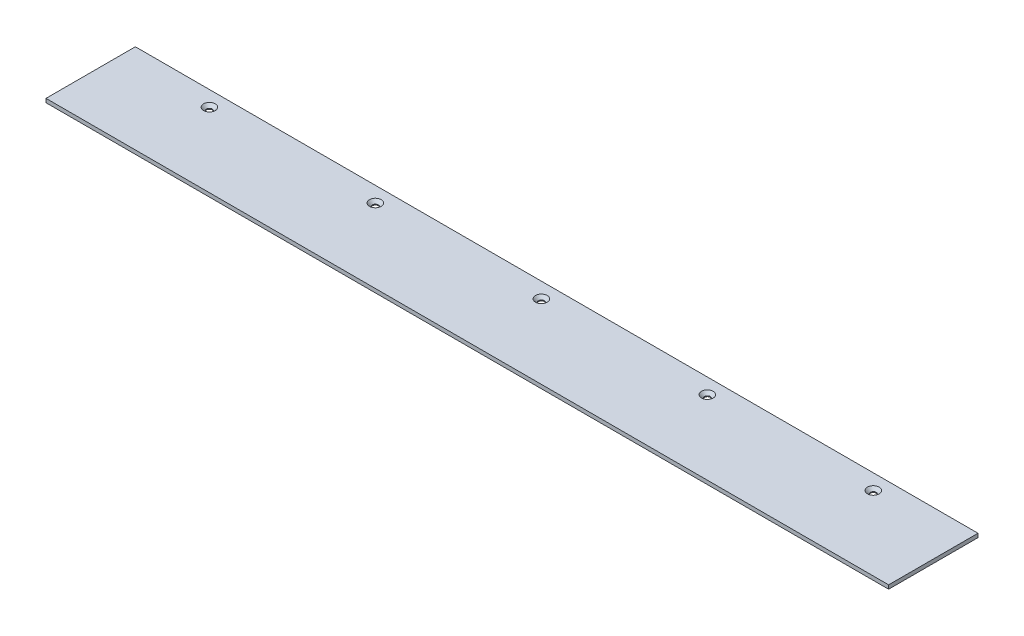
ISO-10303-21;
HEADER;
FILE_DESCRIPTION(('STEP AP214'),'2;1');
FILE_NAME('part.step','',(''),(''),'','','');
FILE_SCHEMA(('AUTOMOTIVE_DESIGN { 1 0 10303 214 1 1 1 1 }'));
ENDSEC;
DATA;
#1=APPLICATION_CONTEXT('core data for automotive mechanical design processes');
#2=APPLICATION_PROTOCOL_DEFINITION('international standard','automotive_design',2000,#1);
#3=PRODUCT_CONTEXT('',#1,'mechanical');
#4=PRODUCT('Part','Part','',(#3));
#5=PRODUCT_RELATED_PRODUCT_CATEGORY('part','',(#4));
#6=PRODUCT_DEFINITION_FORMATION('','',#4);
#7=PRODUCT_DEFINITION_CONTEXT('part definition',#1,'design');
#8=PRODUCT_DEFINITION('design','',#6,#7);
#9=PRODUCT_DEFINITION_SHAPE('','',#8);
#10=(LENGTH_UNIT() NAMED_UNIT(*) SI_UNIT(.MILLI.,.METRE.));
#11=(NAMED_UNIT(*) PLANE_ANGLE_UNIT() SI_UNIT($,.RADIAN.));
#12=(NAMED_UNIT(*) SI_UNIT($,.STERADIAN.) SOLID_ANGLE_UNIT());
#13=UNCERTAINTY_MEASURE_WITH_UNIT(LENGTH_MEASURE(1.E-05),#10,'distance_accuracy_value','');
#14=(GEOMETRIC_REPRESENTATION_CONTEXT(3) GLOBAL_UNCERTAINTY_ASSIGNED_CONTEXT((#13)) GLOBAL_UNIT_ASSIGNED_CONTEXT((#10,
#11,#12)) REPRESENTATION_CONTEXT('',''));
#15=CARTESIAN_POINT('',(0.,0.,0.));
#16=DIRECTION('',(0.,0.,1.));
#17=DIRECTION('',(1.,0.,0.));
#18=AXIS2_PLACEMENT_3D('',#15,#16,#17);
#19=CARTESIAN_POINT('',(-330.,3.,-35.));
#20=DIRECTION('',(1.,0.,0.));
#21=DIRECTION('',(0.,0.,-1.));
#22=AXIS2_PLACEMENT_3D('',#19,#20,#21);
#23=PLANE('',#22);
#24=DIRECTION('',(0.,0.,1.));
#25=VECTOR('',#24,1.);
#26=CARTESIAN_POINT('',(-330.,0.,-35.));
#27=LINE('',#26,#25);
#28=CARTESIAN_POINT('',(-330.,0.,-35.));
#29=VERTEX_POINT('',#28);
#30=CARTESIAN_POINT('',(-330.,0.,35.));
#31=VERTEX_POINT('',#30);
#32=EDGE_CURVE('E103',#29,#31,#27,.T.);
#33=ORIENTED_EDGE('',*,*,#32,.T.);
#34=DIRECTION('',(0.,-1.,0.));
#35=VECTOR('',#34,1.);
#36=CARTESIAN_POINT('',(-330.,3.,35.));
#37=LINE('',#36,#35);
#38=CARTESIAN_POINT('',(-330.,3.,35.));
#39=VERTEX_POINT('',#38);
#40=EDGE_CURVE('E94',#39,#31,#37,.T.);
#41=ORIENTED_EDGE('',*,*,#40,.F.);
#42=DIRECTION('',(0.,0.,1.));
#43=VECTOR('',#42,1.);
#44=CARTESIAN_POINT('',(-330.,3.,-35.));
#45=LINE('',#44,#43);
#46=CARTESIAN_POINT('',(-330.,3.,-35.));
#47=VERTEX_POINT('',#46);
#48=EDGE_CURVE('E88',#47,#39,#45,.T.);
#49=ORIENTED_EDGE('',*,*,#48,.F.);
#50=DIRECTION('',(0.,-1.,0.));
#51=VECTOR('',#50,1.);
#52=CARTESIAN_POINT('',(-330.,3.,-35.));
#53=LINE('',#52,#51);
#54=EDGE_CURVE('E99',#47,#29,#53,.T.);
#55=ORIENTED_EDGE('',*,*,#54,.T.);
#56=EDGE_LOOP('',(#33,#41,#49,#55));
#57=FACE_BOUND('',#56,.T.);
#58=ADVANCED_FACE('F34',(#57),#23,.F.);
#59=CARTESIAN_POINT('',(-330.,3.,35.));
#60=DIRECTION('',(0.,0.,-1.));
#61=DIRECTION('',(-1.,0.,0.));
#62=AXIS2_PLACEMENT_3D('',#59,#60,#61);
#63=PLANE('',#62);
#64=DIRECTION('',(1.,0.,0.));
#65=VECTOR('',#64,1.);
#66=CARTESIAN_POINT('',(-330.,0.,35.));
#67=LINE('',#66,#65);
#68=CARTESIAN_POINT('',(330.,0.,35.));
#69=VERTEX_POINT('',#68);
#70=EDGE_CURVE('E93',#31,#69,#67,.T.);
#71=ORIENTED_EDGE('',*,*,#70,.T.);
#72=DIRECTION('',(0.,-1.,0.));
#73=VECTOR('',#72,1.);
#74=CARTESIAN_POINT('',(330.,3.,35.));
#75=LINE('',#74,#73);
#76=CARTESIAN_POINT('',(330.,3.,35.));
#77=VERTEX_POINT('',#76);
#78=EDGE_CURVE('E91',#77,#69,#75,.T.);
#79=ORIENTED_EDGE('',*,*,#78,.F.);
#80=DIRECTION('',(1.,0.,0.));
#81=VECTOR('',#80,1.);
#82=CARTESIAN_POINT('',(-330.,3.,35.));
#83=LINE('',#82,#81);
#84=EDGE_CURVE('E82',#39,#77,#83,.T.);
#85=ORIENTED_EDGE('',*,*,#84,.F.);
#86=ORIENTED_EDGE('',*,*,#40,.T.);
#87=EDGE_LOOP('',(#71,#79,#85,#86));
#88=FACE_BOUND('',#87,.T.);
#89=ADVANCED_FACE('F92',(#88),#63,.F.);
#90=CARTESIAN_POINT('',(330.,3.,-35.));
#91=DIRECTION('',(-1.,0.,0.));
#92=DIRECTION('',(0.,0.,1.));
#93=AXIS2_PLACEMENT_3D('',#90,#91,#92);
#94=PLANE('',#93);
#95=DIRECTION('',(0.,0.,-1.));
#96=VECTOR('',#95,1.);
#97=CARTESIAN_POINT('',(330.,0.,-35.));
#98=LINE('',#97,#96);
#99=CARTESIAN_POINT('',(330.,0.,-35.));
#100=VERTEX_POINT('',#99);
#101=EDGE_CURVE('E68',#69,#100,#98,.T.);
#102=ORIENTED_EDGE('',*,*,#101,.T.);
#103=DIRECTION('',(0.,-1.,0.));
#104=VECTOR('',#103,1.);
#105=CARTESIAN_POINT('',(330.,3.,-35.));
#106=LINE('',#105,#104);
#107=CARTESIAN_POINT('',(330.,3.,-35.));
#108=VERTEX_POINT('',#107);
#109=EDGE_CURVE('E95',#108,#100,#106,.T.);
#110=ORIENTED_EDGE('',*,*,#109,.F.);
#111=DIRECTION('',(0.,0.,-1.));
#112=VECTOR('',#111,1.);
#113=CARTESIAN_POINT('',(330.,3.,-35.));
#114=LINE('',#113,#112);
#115=EDGE_CURVE('E86',#77,#108,#114,.T.);
#116=ORIENTED_EDGE('',*,*,#115,.F.);
#117=ORIENTED_EDGE('',*,*,#78,.T.);
#118=EDGE_LOOP('',(#102,#110,#116,#117));
#119=FACE_BOUND('',#118,.T.);
#120=ADVANCED_FACE('F97',(#119),#94,.F.);
#121=CARTESIAN_POINT('',(-330.,3.,-35.));
#122=DIRECTION('',(0.,0.,1.));
#123=DIRECTION('',(1.,0.,0.));
#124=AXIS2_PLACEMENT_3D('',#121,#122,#123);
#125=PLANE('',#124);
#126=DIRECTION('',(-1.,0.,0.));
#127=VECTOR('',#126,1.);
#128=CARTESIAN_POINT('',(-330.,0.,-35.));
#129=LINE('',#128,#127);
#130=EDGE_CURVE('E74',#100,#29,#129,.T.);
#131=ORIENTED_EDGE('',*,*,#130,.T.);
#132=ORIENTED_EDGE('',*,*,#54,.F.);
#133=DIRECTION('',(-1.,0.,0.));
#134=VECTOR('',#133,1.);
#135=CARTESIAN_POINT('',(-330.,3.,-35.));
#136=LINE('',#135,#134);
#137=EDGE_CURVE('E51',#108,#47,#136,.T.);
#138=ORIENTED_EDGE('',*,*,#137,.F.);
#139=ORIENTED_EDGE('',*,*,#109,.T.);
#140=EDGE_LOOP('',(#131,#132,#138,#139));
#141=FACE_BOUND('',#140,.T.);
#142=ADVANCED_FACE('F149',(#141),#125,.F.);
#143=CARTESIAN_POINT('',(0.,3.,0.));
#144=DIRECTION('',(0.,1.,0.));
#145=DIRECTION('',(0.,0.,1.));
#146=AXIS2_PLACEMENT_3D('',#143,#144,#145);
#147=PLANE('',#146);
#148=CARTESIAN_POINT('',(-130.,3.,-23.));
#149=DIRECTION('',(0.,1.,0.));
#150=DIRECTION('',(0.,0.,1.));
#151=AXIS2_PLACEMENT_3D('',#148,#149,#150);
#152=CIRCLE('',#151,4.58999999999998);
#153=CARTESIAN_POINT('',(-130.,3.,-18.41));
#154=VERTEX_POINT('',#153);
#155=EDGE_CURVE('E316',#154,#154,#152,.T.);
#156=ORIENTED_EDGE('',*,*,#155,.F.);
#157=EDGE_LOOP('',(#156));
#158=FACE_BOUND('',#157,.T.);
#159=CARTESIAN_POINT('',(-260.,3.,-23.));
#160=DIRECTION('',(0.,1.,0.));
#161=DIRECTION('',(0.,0.,1.));
#162=AXIS2_PLACEMENT_3D('',#159,#160,#161);
#163=CIRCLE('',#162,4.58999999999998);
#164=CARTESIAN_POINT('',(-260.,3.,-18.41));
#165=VERTEX_POINT('',#164);
#166=EDGE_CURVE('E304',#165,#165,#163,.T.);
#167=ORIENTED_EDGE('',*,*,#166,.F.);
#168=EDGE_LOOP('',(#167));
#169=FACE_BOUND('',#168,.T.);
#170=ORIENTED_EDGE('',*,*,#48,.T.);
#171=ORIENTED_EDGE('',*,*,#84,.T.);
#172=ORIENTED_EDGE('',*,*,#115,.T.);
#173=ORIENTED_EDGE('',*,*,#137,.T.);
#174=EDGE_LOOP('',(#170,#171,#172,#173));
#175=FACE_BOUND('',#174,.T.);
#176=CARTESIAN_POINT('',(0.,3.,-23.));
#177=DIRECTION('',(0.,1.,0.));
#178=DIRECTION('',(0.,0.,1.));
#179=AXIS2_PLACEMENT_3D('',#176,#177,#178);
#180=CIRCLE('',#179,4.58999999999998);
#181=CARTESIAN_POINT('',(0.,3.,-18.41));
#182=VERTEX_POINT('',#181);
#183=EDGE_CURVE('E113',#182,#182,#180,.T.);
#184=ORIENTED_EDGE('',*,*,#183,.F.);
#185=EDGE_LOOP('',(#184));
#186=FACE_BOUND('',#185,.T.);
#187=CARTESIAN_POINT('',(130.,3.,-23.));
#188=DIRECTION('',(0.,1.,0.));
#189=DIRECTION('',(0.,0.,1.));
#190=AXIS2_PLACEMENT_3D('',#187,#188,#189);
#191=CIRCLE('',#190,4.58999999999998);
#192=CARTESIAN_POINT('',(130.,3.,-18.41));
#193=VERTEX_POINT('',#192);
#194=EDGE_CURVE('E122',#193,#193,#191,.T.);
#195=ORIENTED_EDGE('',*,*,#194,.F.);
#196=EDGE_LOOP('',(#195));
#197=FACE_BOUND('',#196,.T.);
#198=CARTESIAN_POINT('',(260.,3.,-23.));
#199=DIRECTION('',(0.,1.,0.));
#200=DIRECTION('',(0.,0.,1.));
#201=AXIS2_PLACEMENT_3D('',#198,#199,#200);
#202=CIRCLE('',#201,4.58999999999998);
#203=CARTESIAN_POINT('',(260.,3.,-18.41));
#204=VERTEX_POINT('',#203);
#205=EDGE_CURVE('E131',#204,#204,#202,.T.);
#206=ORIENTED_EDGE('',*,*,#205,.F.);
#207=EDGE_LOOP('',(#206));
#208=FACE_BOUND('',#207,.T.);
#209=ADVANCED_FACE('F83',(#158,#169,#175,#186,#197,#208),#147,.T.);
#210=CARTESIAN_POINT('',(0.,0.,0.));
#211=DIRECTION('',(0.,1.,0.));
#212=DIRECTION('',(0.,0.,1.));
#213=AXIS2_PLACEMENT_3D('',#210,#211,#212);
#214=PLANE('',#213);
#215=CARTESIAN_POINT('',(-130.,0.,-23.));
#216=DIRECTION('',(0.,1.,0.));
#217=DIRECTION('',(0.,0.,1.));
#218=AXIS2_PLACEMENT_3D('',#215,#216,#217);
#219=CIRCLE('',#218,2.24999999999997);
#220=CARTESIAN_POINT('',(-130.,0.,-20.75));
#221=VERTEX_POINT('',#220);
#222=EDGE_CURVE('E313',#221,#221,#219,.T.);
#223=ORIENTED_EDGE('',*,*,#222,.T.);
#224=EDGE_LOOP('',(#223));
#225=FACE_BOUND('',#224,.T.);
#226=CARTESIAN_POINT('',(-260.,0.,-23.));
#227=DIRECTION('',(0.,1.,0.));
#228=DIRECTION('',(0.,0.,1.));
#229=AXIS2_PLACEMENT_3D('',#226,#227,#228);
#230=CIRCLE('',#229,2.24999999999997);
#231=CARTESIAN_POINT('',(-260.,0.,-20.75));
#232=VERTEX_POINT('',#231);
#233=EDGE_CURVE('E106',#232,#232,#230,.T.);
#234=ORIENTED_EDGE('',*,*,#233,.T.);
#235=EDGE_LOOP('',(#234));
#236=FACE_BOUND('',#235,.T.);
#237=ORIENTED_EDGE('',*,*,#32,.F.);
#238=ORIENTED_EDGE('',*,*,#130,.F.);
#239=ORIENTED_EDGE('',*,*,#101,.F.);
#240=ORIENTED_EDGE('',*,*,#70,.F.);
#241=EDGE_LOOP('',(#237,#238,#239,#240));
#242=FACE_BOUND('',#241,.T.);
#243=CARTESIAN_POINT('',(0.,0.,-23.));
#244=DIRECTION('',(0.,1.,0.));
#245=DIRECTION('',(0.,0.,1.));
#246=AXIS2_PLACEMENT_3D('',#243,#244,#245);
#247=CIRCLE('',#246,2.24999999999997);
#248=CARTESIAN_POINT('',(0.,0.,-20.75));
#249=VERTEX_POINT('',#248);
#250=EDGE_CURVE('E116',#249,#249,#247,.T.);
#251=ORIENTED_EDGE('',*,*,#250,.T.);
#252=EDGE_LOOP('',(#251));
#253=FACE_BOUND('',#252,.T.);
#254=CARTESIAN_POINT('',(130.,0.,-23.));
#255=DIRECTION('',(0.,1.,0.));
#256=DIRECTION('',(0.,0.,1.));
#257=AXIS2_PLACEMENT_3D('',#254,#255,#256);
#258=CIRCLE('',#257,2.24999999999997);
#259=CARTESIAN_POINT('',(130.,0.,-20.75));
#260=VERTEX_POINT('',#259);
#261=EDGE_CURVE('E125',#260,#260,#258,.T.);
#262=ORIENTED_EDGE('',*,*,#261,.T.);
#263=EDGE_LOOP('',(#262));
#264=FACE_BOUND('',#263,.T.);
#265=CARTESIAN_POINT('',(260.,0.,-23.));
#266=DIRECTION('',(0.,1.,0.));
#267=DIRECTION('',(0.,0.,1.));
#268=AXIS2_PLACEMENT_3D('',#265,#266,#267);
#269=CIRCLE('',#268,2.24999999999997);
#270=CARTESIAN_POINT('',(260.,0.,-20.75));
#271=VERTEX_POINT('',#270);
#272=EDGE_CURVE('E43',#271,#271,#269,.T.);
#273=ORIENTED_EDGE('',*,*,#272,.T.);
#274=EDGE_LOOP('',(#273));
#275=FACE_BOUND('',#274,.T.);
#276=ADVANCED_FACE('F136',(#225,#236,#242,#253,#264,#275),#214,.F.);
#277=CARTESIAN_POINT('',(-260.,3.,-23.));
#278=DIRECTION('',(0.,1.,0.));
#279=DIRECTION('',(0.,0.,1.));
#280=AXIS2_PLACEMENT_3D('',#277,#278,#279);
#281=CYLINDRICAL_SURFACE('',#280,2.24999999999997);
#282=ORIENTED_EDGE('',*,*,#233,.F.);
#283=EDGE_LOOP('',(#282));
#284=FACE_BOUND('',#283,.T.);
#285=CARTESIAN_POINT('',(-260.,0.660000000000001,-23.));
#286=DIRECTION('',(0.,1.,0.));
#287=DIRECTION('',(0.,0.,1.));
#288=AXIS2_PLACEMENT_3D('',#285,#286,#287);
#289=CIRCLE('',#288,2.24999999999997);
#290=CARTESIAN_POINT('',(-260.,0.660000000000001,-20.75));
#291=VERTEX_POINT('',#290);
#292=EDGE_CURVE('E303',#291,#291,#289,.T.);
#293=ORIENTED_EDGE('',*,*,#292,.T.);
#294=EDGE_LOOP('',(#293));
#295=FACE_BOUND('',#294,.T.);
#296=ADVANCED_FACE('F156',(#284,#295),#281,.F.);
#297=CARTESIAN_POINT('',(-260.,3.,-23.));
#298=DIRECTION('',(0.,1.,0.));
#299=DIRECTION('',(0.,0.,1.));
#300=AXIS2_PLACEMENT_3D('',#297,#298,#299);
#301=CONICAL_SURFACE('',#300,4.58999999999998,0.78539816339745);
#302=ORIENTED_EDGE('',*,*,#292,.F.);
#303=EDGE_LOOP('',(#302));
#304=FACE_BOUND('',#303,.T.);
#305=ORIENTED_EDGE('',*,*,#166,.T.);
#306=EDGE_LOOP('',(#305));
#307=FACE_BOUND('',#306,.T.);
#308=ADVANCED_FACE('F242',(#304,#307),#301,.F.);
#309=CARTESIAN_POINT('',(-130.,3.,-23.));
#310=DIRECTION('',(0.,1.,0.));
#311=DIRECTION('',(0.,0.,1.));
#312=AXIS2_PLACEMENT_3D('',#309,#310,#311);
#313=CYLINDRICAL_SURFACE('',#312,2.24999999999997);
#314=ORIENTED_EDGE('',*,*,#222,.F.);
#315=EDGE_LOOP('',(#314));
#316=FACE_BOUND('',#315,.T.);
#317=CARTESIAN_POINT('',(-130.,0.660000000000001,-23.));
#318=DIRECTION('',(0.,1.,0.));
#319=DIRECTION('',(0.,0.,1.));
#320=AXIS2_PLACEMENT_3D('',#317,#318,#319);
#321=CIRCLE('',#320,2.24999999999997);
#322=CARTESIAN_POINT('',(-130.,0.660000000000001,-20.75));
#323=VERTEX_POINT('',#322);
#324=EDGE_CURVE('E308',#323,#323,#321,.T.);
#325=ORIENTED_EDGE('',*,*,#324,.T.);
#326=EDGE_LOOP('',(#325));
#327=FACE_BOUND('',#326,.T.);
#328=ADVANCED_FACE('F233',(#316,#327),#313,.F.);
#329=CARTESIAN_POINT('',(-130.,3.,-23.));
#330=DIRECTION('',(0.,1.,0.));
#331=DIRECTION('',(0.,0.,1.));
#332=AXIS2_PLACEMENT_3D('',#329,#330,#331);
#333=CONICAL_SURFACE('',#332,4.58999999999998,0.78539816339745);
#334=ORIENTED_EDGE('',*,*,#324,.F.);
#335=EDGE_LOOP('',(#334));
#336=FACE_BOUND('',#335,.T.);
#337=ORIENTED_EDGE('',*,*,#155,.T.);
#338=EDGE_LOOP('',(#337));
#339=FACE_BOUND('',#338,.T.);
#340=ADVANCED_FACE('F180',(#336,#339),#333,.F.);
#341=CARTESIAN_POINT('',(0.,3.,-23.));
#342=DIRECTION('',(0.,1.,0.));
#343=DIRECTION('',(0.,0.,1.));
#344=AXIS2_PLACEMENT_3D('',#341,#342,#343);
#345=CONICAL_SURFACE('',#344,4.58999999999998,0.78539816339745);
#346=CARTESIAN_POINT('',(0.,0.660000000000001,-23.));
#347=DIRECTION('',(0.,1.,0.));
#348=DIRECTION('',(0.,0.,1.));
#349=AXIS2_PLACEMENT_3D('',#346,#347,#348);
#350=CIRCLE('',#349,2.24999999999997);
#351=CARTESIAN_POINT('',(0.,0.660000000000001,-20.75));
#352=VERTEX_POINT('',#351);
#353=EDGE_CURVE('E119',#352,#352,#350,.T.);
#354=ORIENTED_EDGE('',*,*,#353,.F.);
#355=EDGE_LOOP('',(#354));
#356=FACE_BOUND('',#355,.T.);
#357=ORIENTED_EDGE('',*,*,#183,.T.);
#358=EDGE_LOOP('',(#357));
#359=FACE_BOUND('',#358,.T.);
#360=ADVANCED_FACE('F176',(#356,#359),#345,.F.);
#361=CARTESIAN_POINT('',(0.,3.,-23.));
#362=DIRECTION('',(0.,1.,0.));
#363=DIRECTION('',(0.,0.,1.));
#364=AXIS2_PLACEMENT_3D('',#361,#362,#363);
#365=CYLINDRICAL_SURFACE('',#364,2.24999999999997);
#366=ORIENTED_EDGE('',*,*,#250,.F.);
#367=EDGE_LOOP('',(#366));
#368=FACE_BOUND('',#367,.T.);
#369=ORIENTED_EDGE('',*,*,#353,.T.);
#370=EDGE_LOOP('',(#369));
#371=FACE_BOUND('',#370,.T.);
#372=ADVANCED_FACE('F172',(#368,#371),#365,.F.);
#373=CARTESIAN_POINT('',(130.,3.,-23.));
#374=DIRECTION('',(0.,1.,0.));
#375=DIRECTION('',(0.,0.,1.));
#376=AXIS2_PLACEMENT_3D('',#373,#374,#375);
#377=CONICAL_SURFACE('',#376,4.58999999999998,0.78539816339745);
#378=CARTESIAN_POINT('',(130.,0.660000000000001,-23.));
#379=DIRECTION('',(0.,1.,0.));
#380=DIRECTION('',(0.,0.,1.));
#381=AXIS2_PLACEMENT_3D('',#378,#379,#380);
#382=CIRCLE('',#381,2.24999999999997);
#383=CARTESIAN_POINT('',(130.,0.660000000000001,-20.75));
#384=VERTEX_POINT('',#383);
#385=EDGE_CURVE('E128',#384,#384,#382,.T.);
#386=ORIENTED_EDGE('',*,*,#385,.F.);
#387=EDGE_LOOP('',(#386));
#388=FACE_BOUND('',#387,.T.);
#389=ORIENTED_EDGE('',*,*,#194,.T.);
#390=EDGE_LOOP('',(#389));
#391=FACE_BOUND('',#390,.T.);
#392=ADVANCED_FACE('F175',(#388,#391),#377,.F.);
#393=CARTESIAN_POINT('',(130.,3.,-23.));
#394=DIRECTION('',(0.,1.,0.));
#395=DIRECTION('',(0.,0.,1.));
#396=AXIS2_PLACEMENT_3D('',#393,#394,#395);
#397=CYLINDRICAL_SURFACE('',#396,2.24999999999997);
#398=ORIENTED_EDGE('',*,*,#261,.F.);
#399=EDGE_LOOP('',(#398));
#400=FACE_BOUND('',#399,.T.);
#401=ORIENTED_EDGE('',*,*,#385,.T.);
#402=EDGE_LOOP('',(#401));
#403=FACE_BOUND('',#402,.T.);
#404=ADVANCED_FACE('F145',(#400,#403),#397,.F.);
#405=CARTESIAN_POINT('',(260.,3.,-23.));
#406=DIRECTION('',(0.,1.,0.));
#407=DIRECTION('',(0.,0.,1.));
#408=AXIS2_PLACEMENT_3D('',#405,#406,#407);
#409=CONICAL_SURFACE('',#408,4.58999999999998,0.78539816339745);
#410=CARTESIAN_POINT('',(260.,0.660000000000001,-23.));
#411=DIRECTION('',(0.,1.,0.));
#412=DIRECTION('',(0.,0.,1.));
#413=AXIS2_PLACEMENT_3D('',#410,#411,#412);
#414=CIRCLE('',#413,2.24999999999997);
#415=CARTESIAN_POINT('',(260.,0.660000000000001,-20.75));
#416=VERTEX_POINT('',#415);
#417=EDGE_CURVE('E11',#416,#416,#414,.T.);
#418=ORIENTED_EDGE('',*,*,#417,.F.);
#419=EDGE_LOOP('',(#418));
#420=FACE_BOUND('',#419,.T.);
#421=ORIENTED_EDGE('',*,*,#205,.T.);
#422=EDGE_LOOP('',(#421));
#423=FACE_BOUND('',#422,.T.);
#424=ADVANCED_FACE('F36',(#420,#423),#409,.F.);
#425=CARTESIAN_POINT('',(260.,3.,-23.));
#426=DIRECTION('',(0.,1.,0.));
#427=DIRECTION('',(0.,0.,1.));
#428=AXIS2_PLACEMENT_3D('',#425,#426,#427);
#429=CYLINDRICAL_SURFACE('',#428,2.24999999999997);
#430=ORIENTED_EDGE('',*,*,#272,.F.);
#431=EDGE_LOOP('',(#430));
#432=FACE_BOUND('',#431,.T.);
#433=ORIENTED_EDGE('',*,*,#417,.T.);
#434=EDGE_LOOP('',(#433));
#435=FACE_BOUND('',#434,.T.);
#436=ADVANCED_FACE('F138',(#432,#435),#429,.F.);
#437=CLOSED_SHELL('',(#58,#89,#120,#142,#209,#276,#296,#308,#328,#340,#360,#372,#392,#404,#424,#436));
#438=MANIFOLD_SOLID_BREP('B2',#437);
#439=ADVANCED_BREP_SHAPE_REPRESENTATION('',(#18,#438),#14);
#440=SHAPE_DEFINITION_REPRESENTATION(#9,#439);
ENDSEC;
END-ISO-10303-21;
